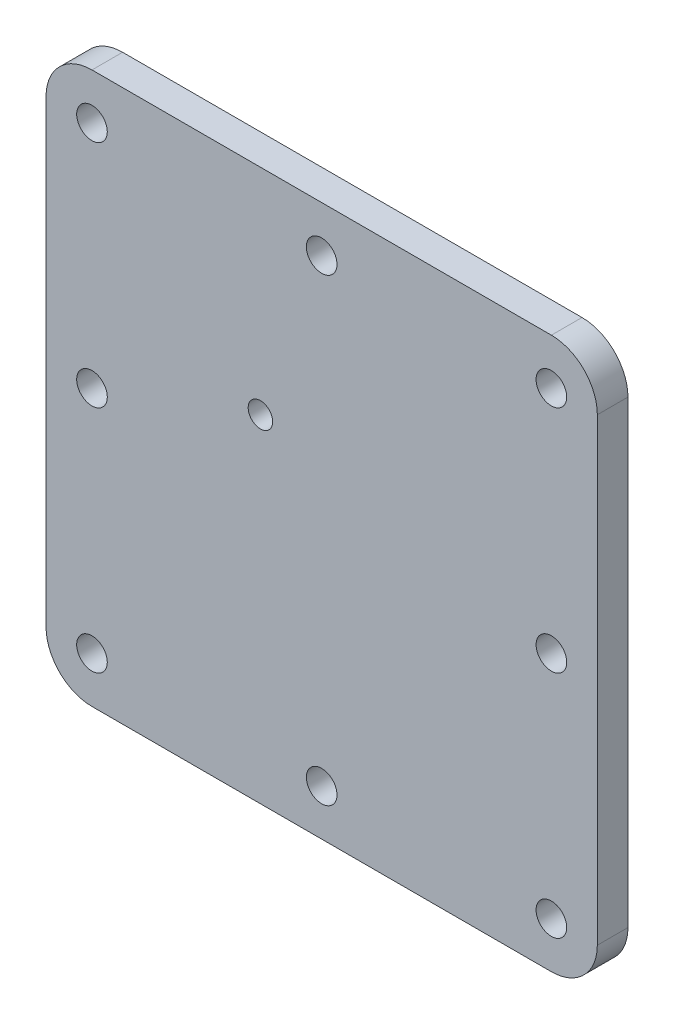
ISO-10303-21;
HEADER;
FILE_DESCRIPTION(('STEP AP214'),'2;1');
FILE_NAME('part.step','',(''),(''),'','','');
FILE_SCHEMA(('AUTOMOTIVE_DESIGN { 1 0 10303 214 1 1 1 1 }'));
ENDSEC;
DATA;
#1=APPLICATION_CONTEXT('core data for automotive mechanical design processes');
#2=APPLICATION_PROTOCOL_DEFINITION('international standard','automotive_design',2000,#1);
#3=PRODUCT_CONTEXT('',#1,'mechanical');
#4=PRODUCT('Part','Part','',(#3));
#5=PRODUCT_RELATED_PRODUCT_CATEGORY('part','',(#4));
#6=PRODUCT_DEFINITION_FORMATION('','',#4);
#7=PRODUCT_DEFINITION_CONTEXT('part definition',#1,'design');
#8=PRODUCT_DEFINITION('design','',#6,#7);
#9=PRODUCT_DEFINITION_SHAPE('','',#8);
#10=(LENGTH_UNIT() NAMED_UNIT(*) SI_UNIT(.MILLI.,.METRE.));
#11=(NAMED_UNIT(*) PLANE_ANGLE_UNIT() SI_UNIT($,.RADIAN.));
#12=(NAMED_UNIT(*) SI_UNIT($,.STERADIAN.) SOLID_ANGLE_UNIT());
#13=UNCERTAINTY_MEASURE_WITH_UNIT(LENGTH_MEASURE(1.E-05),#10,'distance_accuracy_value','');
#14=(GEOMETRIC_REPRESENTATION_CONTEXT(3) GLOBAL_UNCERTAINTY_ASSIGNED_CONTEXT((#13)) GLOBAL_UNIT_ASSIGNED_CONTEXT((#10,
#11,#12)) REPRESENTATION_CONTEXT('',''));
#15=CARTESIAN_POINT('',(0.,0.,0.));
#16=DIRECTION('',(0.,0.,1.));
#17=DIRECTION('',(1.,0.,0.));
#18=AXIS2_PLACEMENT_3D('',#15,#16,#17);
#19=CARTESIAN_POINT('',(-75.,-75.,10.));
#20=DIRECTION('',(0.,0.,1.));
#21=DIRECTION('',(1.,0.,0.));
#22=AXIS2_PLACEMENT_3D('',#19,#20,#21);
#23=PLANE('',#22);
#24=CARTESIAN_POINT('',(-20.,20.,10.));
#25=DIRECTION('',(0.,0.,1.));
#26=DIRECTION('',(1.,0.,0.));
#27=AXIS2_PLACEMENT_3D('',#24,#25,#26);
#28=CIRCLE('',#27,4.);
#29=CARTESIAN_POINT('',(-16.,20.,10.));
#30=VERTEX_POINT('',#29);
#31=EDGE_CURVE('E227',#30,#30,#28,.T.);
#32=ORIENTED_EDGE('',*,*,#31,.F.);
#33=EDGE_LOOP('',(#32));
#34=FACE_BOUND('',#33,.T.);
#35=CARTESIAN_POINT('',(1.54341102686378E-12,-75.,10.));
#36=DIRECTION('',(0.,0.,1.));
#37=DIRECTION('',(1.,0.,0.));
#38=AXIS2_PLACEMENT_3D('',#35,#36,#37);
#39=CIRCLE('',#38,5.);
#40=CARTESIAN_POINT('',(5.00000000000154,-75.,10.));
#41=VERTEX_POINT('',#40);
#42=EDGE_CURVE('E212',#41,#41,#39,.T.);
#43=ORIENTED_EDGE('',*,*,#42,.F.);
#44=EDGE_LOOP('',(#43));
#45=FACE_BOUND('',#44,.T.);
#46=CARTESIAN_POINT('',(75.0000000000008,0.,10.));
#47=DIRECTION('',(0.,0.,1.));
#48=DIRECTION('',(1.,0.,0.));
#49=AXIS2_PLACEMENT_3D('',#46,#47,#48);
#50=CIRCLE('',#49,5.);
#51=CARTESIAN_POINT('',(80.0000000000008,0.,10.));
#52=VERTEX_POINT('',#51);
#53=EDGE_CURVE('E200',#52,#52,#50,.T.);
#54=ORIENTED_EDGE('',*,*,#53,.F.);
#55=EDGE_LOOP('',(#54));
#56=FACE_BOUND('',#55,.T.);
#57=CARTESIAN_POINT('',(75.,75.,10.));
#58=DIRECTION('',(0.,0.,1.));
#59=DIRECTION('',(1.,0.,0.));
#60=AXIS2_PLACEMENT_3D('',#57,#58,#59);
#61=CIRCLE('',#60,5.00000000000001);
#62=CARTESIAN_POINT('',(80.,75.,10.));
#63=VERTEX_POINT('',#62);
#64=EDGE_CURVE('E188',#63,#63,#61,.T.);
#65=ORIENTED_EDGE('',*,*,#64,.F.);
#66=EDGE_LOOP('',(#65));
#67=FACE_BOUND('',#66,.T.);
#68=CARTESIAN_POINT('',(-75.,75.,10.));
#69=DIRECTION('',(0.,0.,1.));
#70=DIRECTION('',(1.,0.,0.));
#71=AXIS2_PLACEMENT_3D('',#68,#69,#70);
#72=CIRCLE('',#71,5.00000000000001);
#73=CARTESIAN_POINT('',(-70.,75.,10.));
#74=VERTEX_POINT('',#73);
#75=EDGE_CURVE('E134',#74,#74,#72,.T.);
#76=ORIENTED_EDGE('',*,*,#75,.F.);
#77=EDGE_LOOP('',(#76));
#78=FACE_BOUND('',#77,.T.);
#79=CARTESIAN_POINT('',(-75.,-75.,10.));
#80=DIRECTION('',(0.,0.,1.));
#81=DIRECTION('',(1.,0.,0.));
#82=AXIS2_PLACEMENT_3D('',#79,#80,#81);
#83=CIRCLE('',#82,15.);
#84=CARTESIAN_POINT('',(-90.,-74.9999999999999,10.));
#85=VERTEX_POINT('',#84);
#86=CARTESIAN_POINT('',(-74.9999999999999,-90.,10.));
#87=VERTEX_POINT('',#86);
#88=EDGE_CURVE('E145',#85,#87,#83,.T.);
#89=ORIENTED_EDGE('',*,*,#88,.T.);
#90=DIRECTION('',(1.,0.,0.));
#91=VECTOR('',#90,1.);
#92=CARTESIAN_POINT('',(-74.9999999999999,-90.,10.));
#93=LINE('',#92,#91);
#94=CARTESIAN_POINT('',(75.,-89.9999999999992,10.));
#95=VERTEX_POINT('',#94);
#96=EDGE_CURVE('E93',#87,#95,#93,.T.);
#97=ORIENTED_EDGE('',*,*,#96,.T.);
#98=CARTESIAN_POINT('',(75.,-74.9999999999992,10.));
#99=DIRECTION('',(0.,0.,1.));
#100=DIRECTION('',(1.,0.,0.));
#101=AXIS2_PLACEMENT_3D('',#98,#99,#100);
#102=CIRCLE('',#101,15.);
#103=CARTESIAN_POINT('',(90.,-75.,10.));
#104=VERTEX_POINT('',#103);
#105=EDGE_CURVE('E160',#95,#104,#102,.T.);
#106=ORIENTED_EDGE('',*,*,#105,.T.);
#107=DIRECTION('',(0.,1.,0.));
#108=VECTOR('',#107,1.);
#109=CARTESIAN_POINT('',(90.,75.0000000000019,10.));
#110=LINE('',#109,#108);
#111=CARTESIAN_POINT('',(90.,75.0000000000019,10.));
#112=VERTEX_POINT('',#111);
#113=EDGE_CURVE('E173',#104,#112,#110,.T.);
#114=ORIENTED_EDGE('',*,*,#113,.T.);
#115=CARTESIAN_POINT('',(75.,75.,10.));
#116=DIRECTION('',(0.,0.,1.));
#117=DIRECTION('',(-1.,0.,0.));
#118=AXIS2_PLACEMENT_3D('',#115,#116,#117);
#119=CIRCLE('',#118,15.);
#120=CARTESIAN_POINT('',(74.9999999999999,90.,10.));
#121=VERTEX_POINT('',#120);
#122=EDGE_CURVE('E112',#112,#121,#119,.T.);
#123=ORIENTED_EDGE('',*,*,#122,.T.);
#124=DIRECTION('',(-1.,0.,0.));
#125=VECTOR('',#124,1.);
#126=CARTESIAN_POINT('',(-74.9999999999999,90.,10.));
#127=LINE('',#126,#125);
#128=CARTESIAN_POINT('',(-74.9999999999999,90.,10.));
#129=VERTEX_POINT('',#128);
#130=EDGE_CURVE('E106',#121,#129,#127,.T.);
#131=ORIENTED_EDGE('',*,*,#130,.T.);
#132=CARTESIAN_POINT('',(-75.,75.,10.));
#133=DIRECTION('',(0.,0.,1.));
#134=DIRECTION('',(1.,0.,0.));
#135=AXIS2_PLACEMENT_3D('',#132,#133,#134);
#136=CIRCLE('',#135,15.);
#137=CARTESIAN_POINT('',(-90.,74.9999999999999,10.));
#138=VERTEX_POINT('',#137);
#139=EDGE_CURVE('E110',#129,#138,#136,.T.);
#140=ORIENTED_EDGE('',*,*,#139,.T.);
#141=DIRECTION('',(0.,-1.,0.));
#142=VECTOR('',#141,1.);
#143=CARTESIAN_POINT('',(-90.,74.9999999999999,10.));
#144=LINE('',#143,#142);
#145=EDGE_CURVE('E50',#138,#85,#144,.T.);
#146=ORIENTED_EDGE('',*,*,#145,.T.);
#147=EDGE_LOOP('',(#89,#97,#106,#114,#123,#131,#140,#146));
#148=FACE_BOUND('',#147,.T.);
#149=CARTESIAN_POINT('',(0.,75.,10.));
#150=DIRECTION('',(0.,0.,1.));
#151=DIRECTION('',(1.,0.,0.));
#152=AXIS2_PLACEMENT_3D('',#149,#150,#151);
#153=CIRCLE('',#152,5.);
#154=CARTESIAN_POINT('',(4.99999999999997,75.,10.));
#155=VERTEX_POINT('',#154);
#156=EDGE_CURVE('E182',#155,#155,#153,.T.);
#157=ORIENTED_EDGE('',*,*,#156,.F.);
#158=EDGE_LOOP('',(#157));
#159=FACE_BOUND('',#158,.T.);
#160=CARTESIAN_POINT('',(-74.9999999999992,0.,10.));
#161=DIRECTION('',(0.,0.,1.));
#162=DIRECTION('',(1.,0.,0.));
#163=AXIS2_PLACEMENT_3D('',#160,#161,#162);
#164=CIRCLE('',#163,5.);
#165=CARTESIAN_POINT('',(-69.9999999999992,0.,10.));
#166=VERTEX_POINT('',#165);
#167=EDGE_CURVE('E194',#166,#166,#164,.T.);
#168=ORIENTED_EDGE('',*,*,#167,.F.);
#169=EDGE_LOOP('',(#168));
#170=FACE_BOUND('',#169,.T.);
#171=CARTESIAN_POINT('',(-74.9999999999985,-75.,10.));
#172=DIRECTION('',(0.,0.,1.));
#173=DIRECTION('',(1.,0.,0.));
#174=AXIS2_PLACEMENT_3D('',#171,#172,#173);
#175=CIRCLE('',#174,5.00000000000001);
#176=CARTESIAN_POINT('',(-69.9999999999985,-75.,10.));
#177=VERTEX_POINT('',#176);
#178=EDGE_CURVE('E206',#177,#177,#175,.T.);
#179=ORIENTED_EDGE('',*,*,#178,.F.);
#180=EDGE_LOOP('',(#179));
#181=FACE_BOUND('',#180,.T.);
#182=CARTESIAN_POINT('',(75.0000000000015,-75.,10.));
#183=DIRECTION('',(0.,0.,1.));
#184=DIRECTION('',(1.,0.,0.));
#185=AXIS2_PLACEMENT_3D('',#182,#183,#184);
#186=CIRCLE('',#185,5.00000000000001);
#187=CARTESIAN_POINT('',(80.0000000000015,-75.,10.));
#188=VERTEX_POINT('',#187);
#189=EDGE_CURVE('E218',#188,#188,#186,.T.);
#190=ORIENTED_EDGE('',*,*,#189,.F.);
#191=EDGE_LOOP('',(#190));
#192=FACE_BOUND('',#191,.T.);
#193=ADVANCED_FACE('F33',(#34,#45,#56,#67,#78,#148,#159,#170,#181,#192),#23,.T.);
#194=CARTESIAN_POINT('',(-75.,-75.,0.));
#195=DIRECTION('',(0.,0.,1.));
#196=DIRECTION('',(1.,0.,0.));
#197=AXIS2_PLACEMENT_3D('',#194,#195,#196);
#198=PLANE('',#197);
#199=CARTESIAN_POINT('',(-20.,20.,0.));
#200=DIRECTION('',(0.,0.,1.));
#201=DIRECTION('',(1.,0.,0.));
#202=AXIS2_PLACEMENT_3D('',#199,#200,#201);
#203=CIRCLE('',#202,4.);
#204=CARTESIAN_POINT('',(-16.,20.,0.));
#205=VERTEX_POINT('',#204);
#206=EDGE_CURVE('E224',#205,#205,#203,.T.);
#207=ORIENTED_EDGE('',*,*,#206,.T.);
#208=EDGE_LOOP('',(#207));
#209=FACE_BOUND('',#208,.T.);
#210=CARTESIAN_POINT('',(-75.,-75.,0.));
#211=DIRECTION('',(0.,0.,1.));
#212=DIRECTION('',(1.,0.,0.));
#213=AXIS2_PLACEMENT_3D('',#210,#211,#212);
#214=CIRCLE('',#213,15.);
#215=CARTESIAN_POINT('',(-90.,-74.9999999999999,0.));
#216=VERTEX_POINT('',#215);
#217=CARTESIAN_POINT('',(-74.9999999999999,-90.,0.));
#218=VERTEX_POINT('',#217);
#219=EDGE_CURVE('E130',#216,#218,#214,.T.);
#220=ORIENTED_EDGE('',*,*,#219,.F.);
#221=DIRECTION('',(0.,-1.,0.));
#222=VECTOR('',#221,1.);
#223=CARTESIAN_POINT('',(-90.,74.9999999999999,0.));
#224=LINE('',#223,#222);
#225=CARTESIAN_POINT('',(-90.,74.9999999999999,0.));
#226=VERTEX_POINT('',#225);
#227=EDGE_CURVE('E85',#226,#216,#224,.T.);
#228=ORIENTED_EDGE('',*,*,#227,.F.);
#229=CARTESIAN_POINT('',(-75.,75.,0.));
#230=DIRECTION('',(0.,0.,1.));
#231=DIRECTION('',(1.,0.,0.));
#232=AXIS2_PLACEMENT_3D('',#229,#230,#231);
#233=CIRCLE('',#232,15.);
#234=CARTESIAN_POINT('',(-74.9999999999999,90.,0.));
#235=VERTEX_POINT('',#234);
#236=EDGE_CURVE('E79',#235,#226,#233,.T.);
#237=ORIENTED_EDGE('',*,*,#236,.F.);
#238=DIRECTION('',(-1.,0.,0.));
#239=VECTOR('',#238,1.);
#240=CARTESIAN_POINT('',(-74.9999999999999,90.,0.));
#241=LINE('',#240,#239);
#242=CARTESIAN_POINT('',(74.9999999999999,90.,0.));
#243=VERTEX_POINT('',#242);
#244=EDGE_CURVE('E120',#243,#235,#241,.T.);
#245=ORIENTED_EDGE('',*,*,#244,.F.);
#246=CARTESIAN_POINT('',(75.,75.,0.));
#247=DIRECTION('',(0.,0.,1.));
#248=DIRECTION('',(-1.,0.,0.));
#249=AXIS2_PLACEMENT_3D('',#246,#247,#248);
#250=CIRCLE('',#249,15.);
#251=CARTESIAN_POINT('',(90.,75.0000000000019,0.));
#252=VERTEX_POINT('',#251);
#253=EDGE_CURVE('E140',#252,#243,#250,.T.);
#254=ORIENTED_EDGE('',*,*,#253,.F.);
#255=DIRECTION('',(0.,1.,0.));
#256=VECTOR('',#255,1.);
#257=CARTESIAN_POINT('',(90.,75.0000000000019,0.));
#258=LINE('',#257,#256);
#259=CARTESIAN_POINT('',(90.,-75.,0.));
#260=VERTEX_POINT('',#259);
#261=EDGE_CURVE('E138',#260,#252,#258,.T.);
#262=ORIENTED_EDGE('',*,*,#261,.F.);
#263=CARTESIAN_POINT('',(75.,-74.9999999999992,0.));
#264=DIRECTION('',(0.,0.,1.));
#265=DIRECTION('',(1.,0.,0.));
#266=AXIS2_PLACEMENT_3D('',#263,#264,#265);
#267=CIRCLE('',#266,15.);
#268=CARTESIAN_POINT('',(75.,-89.9999999999992,0.));
#269=VERTEX_POINT('',#268);
#270=EDGE_CURVE('E136',#269,#260,#267,.T.);
#271=ORIENTED_EDGE('',*,*,#270,.F.);
#272=DIRECTION('',(1.,0.,0.));
#273=VECTOR('',#272,1.);
#274=CARTESIAN_POINT('',(-74.9999999999999,-90.,0.));
#275=LINE('',#274,#273);
#276=EDGE_CURVE('E133',#218,#269,#275,.T.);
#277=ORIENTED_EDGE('',*,*,#276,.F.);
#278=EDGE_LOOP('',(#220,#228,#237,#245,#254,#262,#271,#277));
#279=FACE_BOUND('',#278,.T.);
#280=CARTESIAN_POINT('',(-75.,75.,0.));
#281=DIRECTION('',(0.,0.,1.));
#282=DIRECTION('',(1.,0.,0.));
#283=AXIS2_PLACEMENT_3D('',#280,#281,#282);
#284=CIRCLE('',#283,5.00000000000001);
#285=CARTESIAN_POINT('',(-70.,75.,0.));
#286=VERTEX_POINT('',#285);
#287=EDGE_CURVE('E179',#286,#286,#284,.T.);
#288=ORIENTED_EDGE('',*,*,#287,.T.);
#289=EDGE_LOOP('',(#288));
#290=FACE_BOUND('',#289,.T.);
#291=CARTESIAN_POINT('',(0.,75.,0.));
#292=DIRECTION('',(0.,0.,1.));
#293=DIRECTION('',(1.,0.,0.));
#294=AXIS2_PLACEMENT_3D('',#291,#292,#293);
#295=CIRCLE('',#294,5.);
#296=CARTESIAN_POINT('',(4.99999999999997,75.,0.));
#297=VERTEX_POINT('',#296);
#298=EDGE_CURVE('E185',#297,#297,#295,.T.);
#299=ORIENTED_EDGE('',*,*,#298,.T.);
#300=EDGE_LOOP('',(#299));
#301=FACE_BOUND('',#300,.T.);
#302=CARTESIAN_POINT('',(75.,75.,0.));
#303=DIRECTION('',(0.,0.,1.));
#304=DIRECTION('',(1.,0.,0.));
#305=AXIS2_PLACEMENT_3D('',#302,#303,#304);
#306=CIRCLE('',#305,5.00000000000001);
#307=CARTESIAN_POINT('',(80.,75.,0.));
#308=VERTEX_POINT('',#307);
#309=EDGE_CURVE('E191',#308,#308,#306,.T.);
#310=ORIENTED_EDGE('',*,*,#309,.T.);
#311=EDGE_LOOP('',(#310));
#312=FACE_BOUND('',#311,.T.);
#313=CARTESIAN_POINT('',(-74.9999999999992,0.,0.));
#314=DIRECTION('',(0.,0.,1.));
#315=DIRECTION('',(1.,0.,0.));
#316=AXIS2_PLACEMENT_3D('',#313,#314,#315);
#317=CIRCLE('',#316,5.);
#318=CARTESIAN_POINT('',(-69.9999999999992,0.,0.));
#319=VERTEX_POINT('',#318);
#320=EDGE_CURVE('E197',#319,#319,#317,.T.);
#321=ORIENTED_EDGE('',*,*,#320,.T.);
#322=EDGE_LOOP('',(#321));
#323=FACE_BOUND('',#322,.T.);
#324=CARTESIAN_POINT('',(75.0000000000008,0.,0.));
#325=DIRECTION('',(0.,0.,1.));
#326=DIRECTION('',(1.,0.,0.));
#327=AXIS2_PLACEMENT_3D('',#324,#325,#326);
#328=CIRCLE('',#327,5.);
#329=CARTESIAN_POINT('',(80.0000000000008,0.,0.));
#330=VERTEX_POINT('',#329);
#331=EDGE_CURVE('E203',#330,#330,#328,.T.);
#332=ORIENTED_EDGE('',*,*,#331,.T.);
#333=EDGE_LOOP('',(#332));
#334=FACE_BOUND('',#333,.T.);
#335=CARTESIAN_POINT('',(-74.9999999999985,-75.,0.));
#336=DIRECTION('',(0.,0.,1.));
#337=DIRECTION('',(1.,0.,0.));
#338=AXIS2_PLACEMENT_3D('',#335,#336,#337);
#339=CIRCLE('',#338,5.00000000000001);
#340=CARTESIAN_POINT('',(-69.9999999999985,-75.,0.));
#341=VERTEX_POINT('',#340);
#342=EDGE_CURVE('E209',#341,#341,#339,.T.);
#343=ORIENTED_EDGE('',*,*,#342,.T.);
#344=EDGE_LOOP('',(#343));
#345=FACE_BOUND('',#344,.T.);
#346=CARTESIAN_POINT('',(1.54341102686378E-12,-75.,0.));
#347=DIRECTION('',(0.,0.,1.));
#348=DIRECTION('',(1.,0.,0.));
#349=AXIS2_PLACEMENT_3D('',#346,#347,#348);
#350=CIRCLE('',#349,5.);
#351=CARTESIAN_POINT('',(5.00000000000154,-75.,0.));
#352=VERTEX_POINT('',#351);
#353=EDGE_CURVE('E215',#352,#352,#350,.T.);
#354=ORIENTED_EDGE('',*,*,#353,.T.);
#355=EDGE_LOOP('',(#354));
#356=FACE_BOUND('',#355,.T.);
#357=CARTESIAN_POINT('',(75.0000000000015,-75.,0.));
#358=DIRECTION('',(0.,0.,1.));
#359=DIRECTION('',(1.,0.,0.));
#360=AXIS2_PLACEMENT_3D('',#357,#358,#359);
#361=CIRCLE('',#360,5.00000000000001);
#362=CARTESIAN_POINT('',(80.0000000000015,-75.,0.));
#363=VERTEX_POINT('',#362);
#364=EDGE_CURVE('E221',#363,#363,#361,.T.);
#365=ORIENTED_EDGE('',*,*,#364,.T.);
#366=EDGE_LOOP('',(#365));
#367=FACE_BOUND('',#366,.T.);
#368=ADVANCED_FACE('F164',(#209,#279,#290,#301,#312,#323,#334,#345,#356,#367),#198,.F.);
#369=CARTESIAN_POINT('',(-75.,-75.,10.));
#370=DIRECTION('',(0.,0.,-1.));
#371=DIRECTION('',(-1.,0.,0.));
#372=AXIS2_PLACEMENT_3D('',#369,#370,#371);
#373=CYLINDRICAL_SURFACE('',#372,15.);
#374=ORIENTED_EDGE('',*,*,#219,.T.);
#375=DIRECTION('',(0.,0.,-1.));
#376=VECTOR('',#375,1.);
#377=CARTESIAN_POINT('',(-74.9999999999999,-90.,10.));
#378=LINE('',#377,#376);
#379=EDGE_CURVE('E11',#87,#218,#378,.T.);
#380=ORIENTED_EDGE('',*,*,#379,.F.);
#381=ORIENTED_EDGE('',*,*,#88,.F.);
#382=DIRECTION('',(0.,0.,-1.));
#383=VECTOR('',#382,1.);
#384=CARTESIAN_POINT('',(-90.,-74.9999999999999,10.));
#385=LINE('',#384,#383);
#386=EDGE_CURVE('E126',#85,#216,#385,.T.);
#387=ORIENTED_EDGE('',*,*,#386,.T.);
#388=EDGE_LOOP('',(#374,#380,#381,#387));
#389=FACE_BOUND('',#388,.T.);
#390=ADVANCED_FACE('F35',(#389),#373,.T.);
#391=CARTESIAN_POINT('',(-74.9999999999999,-90.,10.));
#392=DIRECTION('',(0.,1.,0.));
#393=DIRECTION('',(-1.,0.,0.));
#394=AXIS2_PLACEMENT_3D('',#391,#392,#393);
#395=PLANE('',#394);
#396=ORIENTED_EDGE('',*,*,#276,.T.);
#397=DIRECTION('',(0.,0.,-1.));
#398=VECTOR('',#397,1.);
#399=CARTESIAN_POINT('',(75.,-89.9999999999992,10.));
#400=LINE('',#399,#398);
#401=EDGE_CURVE('E42',#95,#269,#400,.T.);
#402=ORIENTED_EDGE('',*,*,#401,.F.);
#403=ORIENTED_EDGE('',*,*,#96,.F.);
#404=ORIENTED_EDGE('',*,*,#379,.T.);
#405=EDGE_LOOP('',(#396,#402,#403,#404));
#406=FACE_BOUND('',#405,.T.);
#407=ADVANCED_FACE('F316',(#406),#395,.F.);
#408=CARTESIAN_POINT('',(75.,-74.9999999999992,10.));
#409=DIRECTION('',(0.,0.,-1.));
#410=DIRECTION('',(-1.,0.,0.));
#411=AXIS2_PLACEMENT_3D('',#408,#409,#410);
#412=CYLINDRICAL_SURFACE('',#411,15.);
#413=ORIENTED_EDGE('',*,*,#270,.T.);
#414=DIRECTION('',(0.,0.,-1.));
#415=VECTOR('',#414,1.);
#416=CARTESIAN_POINT('',(90.,-75.,10.));
#417=LINE('',#416,#415);
#418=EDGE_CURVE('E152',#104,#260,#417,.T.);
#419=ORIENTED_EDGE('',*,*,#418,.F.);
#420=ORIENTED_EDGE('',*,*,#105,.F.);
#421=ORIENTED_EDGE('',*,*,#401,.T.);
#422=EDGE_LOOP('',(#413,#419,#420,#421));
#423=FACE_BOUND('',#422,.T.);
#424=ADVANCED_FACE('F158',(#423),#412,.T.);
#425=CARTESIAN_POINT('',(90.,75.0000000000019,10.));
#426=DIRECTION('',(-1.,0.,0.));
#427=DIRECTION('',(0.,-1.,0.));
#428=AXIS2_PLACEMENT_3D('',#425,#426,#427);
#429=PLANE('',#428);
#430=ORIENTED_EDGE('',*,*,#261,.T.);
#431=DIRECTION('',(0.,0.,-1.));
#432=VECTOR('',#431,1.);
#433=CARTESIAN_POINT('',(90.,75.0000000000019,10.));
#434=LINE('',#433,#432);
#435=EDGE_CURVE('E149',#112,#252,#434,.T.);
#436=ORIENTED_EDGE('',*,*,#435,.F.);
#437=ORIENTED_EDGE('',*,*,#113,.F.);
#438=ORIENTED_EDGE('',*,*,#418,.T.);
#439=EDGE_LOOP('',(#430,#436,#437,#438));
#440=FACE_BOUND('',#439,.T.);
#441=ADVANCED_FACE('F169',(#440),#429,.F.);
#442=CARTESIAN_POINT('',(75.,75.,10.));
#443=DIRECTION('',(0.,0.,-1.));
#444=DIRECTION('',(-1.,0.,0.));
#445=AXIS2_PLACEMENT_3D('',#442,#443,#444);
#446=CYLINDRICAL_SURFACE('',#445,15.);
#447=ORIENTED_EDGE('',*,*,#253,.T.);
#448=DIRECTION('',(0.,0.,-1.));
#449=VECTOR('',#448,1.);
#450=CARTESIAN_POINT('',(74.9999999999999,90.,10.));
#451=LINE('',#450,#449);
#452=EDGE_CURVE('E121',#121,#243,#451,.T.);
#453=ORIENTED_EDGE('',*,*,#452,.F.);
#454=ORIENTED_EDGE('',*,*,#122,.F.);
#455=ORIENTED_EDGE('',*,*,#435,.T.);
#456=EDGE_LOOP('',(#447,#453,#454,#455));
#457=FACE_BOUND('',#456,.T.);
#458=ADVANCED_FACE('F172',(#457),#446,.T.);
#459=CARTESIAN_POINT('',(-74.9999999999999,90.,10.));
#460=DIRECTION('',(0.,-1.,0.));
#461=DIRECTION('',(0.,0.,-1.));
#462=AXIS2_PLACEMENT_3D('',#459,#460,#461);
#463=PLANE('',#462);
#464=ORIENTED_EDGE('',*,*,#244,.T.);
#465=DIRECTION('',(0.,0.,-1.));
#466=VECTOR('',#465,1.);
#467=CARTESIAN_POINT('',(-74.9999999999999,90.,10.));
#468=LINE('',#467,#466);
#469=EDGE_CURVE('E117',#129,#235,#468,.T.);
#470=ORIENTED_EDGE('',*,*,#469,.F.);
#471=ORIENTED_EDGE('',*,*,#130,.F.);
#472=ORIENTED_EDGE('',*,*,#452,.T.);
#473=EDGE_LOOP('',(#464,#470,#471,#472));
#474=FACE_BOUND('',#473,.T.);
#475=ADVANCED_FACE('F118',(#474),#463,.F.);
#476=CARTESIAN_POINT('',(-75.,75.,10.));
#477=DIRECTION('',(0.,0.,-1.));
#478=DIRECTION('',(-1.,0.,0.));
#479=AXIS2_PLACEMENT_3D('',#476,#477,#478);
#480=CYLINDRICAL_SURFACE('',#479,15.);
#481=ORIENTED_EDGE('',*,*,#236,.T.);
#482=DIRECTION('',(0.,0.,-1.));
#483=VECTOR('',#482,1.);
#484=CARTESIAN_POINT('',(-90.,74.9999999999999,10.));
#485=LINE('',#484,#483);
#486=EDGE_CURVE('E122',#138,#226,#485,.T.);
#487=ORIENTED_EDGE('',*,*,#486,.F.);
#488=ORIENTED_EDGE('',*,*,#139,.F.);
#489=ORIENTED_EDGE('',*,*,#469,.T.);
#490=EDGE_LOOP('',(#481,#487,#488,#489));
#491=FACE_BOUND('',#490,.T.);
#492=ADVANCED_FACE('F124',(#491),#480,.T.);
#493=CARTESIAN_POINT('',(-90.,74.9999999999999,10.));
#494=DIRECTION('',(1.,0.,0.));
#495=DIRECTION('',(0.,1.,0.));
#496=AXIS2_PLACEMENT_3D('',#493,#494,#495);
#497=PLANE('',#496);
#498=ORIENTED_EDGE('',*,*,#227,.T.);
#499=ORIENTED_EDGE('',*,*,#386,.F.);
#500=ORIENTED_EDGE('',*,*,#145,.F.);
#501=ORIENTED_EDGE('',*,*,#486,.T.);
#502=EDGE_LOOP('',(#498,#499,#500,#501));
#503=FACE_BOUND('',#502,.T.);
#504=ADVANCED_FACE('F256',(#503),#497,.F.);
#505=CARTESIAN_POINT('',(-75.,75.,10.));
#506=DIRECTION('',(0.,0.,-1.));
#507=DIRECTION('',(-1.,0.,0.));
#508=AXIS2_PLACEMENT_3D('',#505,#506,#507);
#509=CYLINDRICAL_SURFACE('',#508,5.00000000000001);
#510=ORIENTED_EDGE('',*,*,#75,.T.);
#511=EDGE_LOOP('',(#510));
#512=FACE_BOUND('',#511,.T.);
#513=ORIENTED_EDGE('',*,*,#287,.F.);
#514=EDGE_LOOP('',(#513));
#515=FACE_BOUND('',#514,.T.);
#516=ADVANCED_FACE('F252',(#512,#515),#509,.F.);
#517=CARTESIAN_POINT('',(0.,75.,10.));
#518=DIRECTION('',(0.,0.,-1.));
#519=DIRECTION('',(-1.,0.,0.));
#520=AXIS2_PLACEMENT_3D('',#517,#518,#519);
#521=CYLINDRICAL_SURFACE('',#520,5.);
#522=ORIENTED_EDGE('',*,*,#156,.T.);
#523=EDGE_LOOP('',(#522));
#524=FACE_BOUND('',#523,.T.);
#525=ORIENTED_EDGE('',*,*,#298,.F.);
#526=EDGE_LOOP('',(#525));
#527=FACE_BOUND('',#526,.T.);
#528=ADVANCED_FACE('F255',(#524,#527),#521,.F.);
#529=CARTESIAN_POINT('',(75.,75.,10.));
#530=DIRECTION('',(0.,0.,-1.));
#531=DIRECTION('',(-1.,0.,0.));
#532=AXIS2_PLACEMENT_3D('',#529,#530,#531);
#533=CYLINDRICAL_SURFACE('',#532,5.00000000000001);
#534=ORIENTED_EDGE('',*,*,#64,.T.);
#535=EDGE_LOOP('',(#534));
#536=FACE_BOUND('',#535,.T.);
#537=ORIENTED_EDGE('',*,*,#309,.F.);
#538=EDGE_LOOP('',(#537));
#539=FACE_BOUND('',#538,.T.);
#540=ADVANCED_FACE('F297',(#536,#539),#533,.F.);
#541=CARTESIAN_POINT('',(-74.9999999999992,0.,10.));
#542=DIRECTION('',(0.,0.,-1.));
#543=DIRECTION('',(-1.,0.,0.));
#544=AXIS2_PLACEMENT_3D('',#541,#542,#543);
#545=CYLINDRICAL_SURFACE('',#544,5.);
#546=ORIENTED_EDGE('',*,*,#167,.T.);
#547=EDGE_LOOP('',(#546));
#548=FACE_BOUND('',#547,.T.);
#549=ORIENTED_EDGE('',*,*,#320,.F.);
#550=EDGE_LOOP('',(#549));
#551=FACE_BOUND('',#550,.T.);
#552=ADVANCED_FACE('F293',(#548,#551),#545,.F.);
#553=CARTESIAN_POINT('',(75.0000000000008,0.,10.));
#554=DIRECTION('',(0.,0.,-1.));
#555=DIRECTION('',(-1.,0.,0.));
#556=AXIS2_PLACEMENT_3D('',#553,#554,#555);
#557=CYLINDRICAL_SURFACE('',#556,5.);
#558=ORIENTED_EDGE('',*,*,#53,.T.);
#559=EDGE_LOOP('',(#558));
#560=FACE_BOUND('',#559,.T.);
#561=ORIENTED_EDGE('',*,*,#331,.F.);
#562=EDGE_LOOP('',(#561));
#563=FACE_BOUND('',#562,.T.);
#564=ADVANCED_FACE('F289',(#560,#563),#557,.F.);
#565=CARTESIAN_POINT('',(-74.9999999999985,-75.,10.));
#566=DIRECTION('',(0.,0.,-1.));
#567=DIRECTION('',(-1.,0.,0.));
#568=AXIS2_PLACEMENT_3D('',#565,#566,#567);
#569=CYLINDRICAL_SURFACE('',#568,5.00000000000001);
#570=ORIENTED_EDGE('',*,*,#178,.T.);
#571=EDGE_LOOP('',(#570));
#572=FACE_BOUND('',#571,.T.);
#573=ORIENTED_EDGE('',*,*,#342,.F.);
#574=EDGE_LOOP('',(#573));
#575=FACE_BOUND('',#574,.T.);
#576=ADVANCED_FACE('F283',(#572,#575),#569,.F.);
#577=CARTESIAN_POINT('',(1.54341102686378E-12,-75.,10.));
#578=DIRECTION('',(0.,0.,-1.));
#579=DIRECTION('',(-1.,0.,0.));
#580=AXIS2_PLACEMENT_3D('',#577,#578,#579);
#581=CYLINDRICAL_SURFACE('',#580,5.);
#582=ORIENTED_EDGE('',*,*,#42,.T.);
#583=EDGE_LOOP('',(#582));
#584=FACE_BOUND('',#583,.T.);
#585=ORIENTED_EDGE('',*,*,#353,.F.);
#586=EDGE_LOOP('',(#585));
#587=FACE_BOUND('',#586,.T.);
#588=ADVANCED_FACE('F277',(#584,#587),#581,.F.);
#589=CARTESIAN_POINT('',(75.0000000000015,-75.,10.));
#590=DIRECTION('',(0.,0.,-1.));
#591=DIRECTION('',(-1.,0.,0.));
#592=AXIS2_PLACEMENT_3D('',#589,#590,#591);
#593=CYLINDRICAL_SURFACE('',#592,5.00000000000001);
#594=ORIENTED_EDGE('',*,*,#189,.T.);
#595=EDGE_LOOP('',(#594));
#596=FACE_BOUND('',#595,.T.);
#597=ORIENTED_EDGE('',*,*,#364,.F.);
#598=EDGE_LOOP('',(#597));
#599=FACE_BOUND('',#598,.T.);
#600=ADVANCED_FACE('F237',(#596,#599),#593,.F.);
#601=CARTESIAN_POINT('',(-20.,20.,0.));
#602=DIRECTION('',(0.,0.,1.));
#603=DIRECTION('',(1.,0.,0.));
#604=AXIS2_PLACEMENT_3D('',#601,#602,#603);
#605=CYLINDRICAL_SURFACE('',#604,4.);
#606=ORIENTED_EDGE('',*,*,#206,.F.);
#607=EDGE_LOOP('',(#606));
#608=FACE_BOUND('',#607,.T.);
#609=ORIENTED_EDGE('',*,*,#31,.T.);
#610=EDGE_LOOP('',(#609));
#611=FACE_BOUND('',#610,.T.);
#612=ADVANCED_FACE('F234',(#608,#611),#605,.F.);
#613=CLOSED_SHELL('',(#193,#368,#390,#407,#424,#441,#458,#475,#492,#504,#516,#528,#540,#552,
#564,#576,#588,#600,#612));
#614=MANIFOLD_SOLID_BREP('B2',#613);
#615=ADVANCED_BREP_SHAPE_REPRESENTATION('',(#18,#614),#14);
#616=SHAPE_DEFINITION_REPRESENTATION(#9,#615);
ENDSEC;
END-ISO-10303-21;
